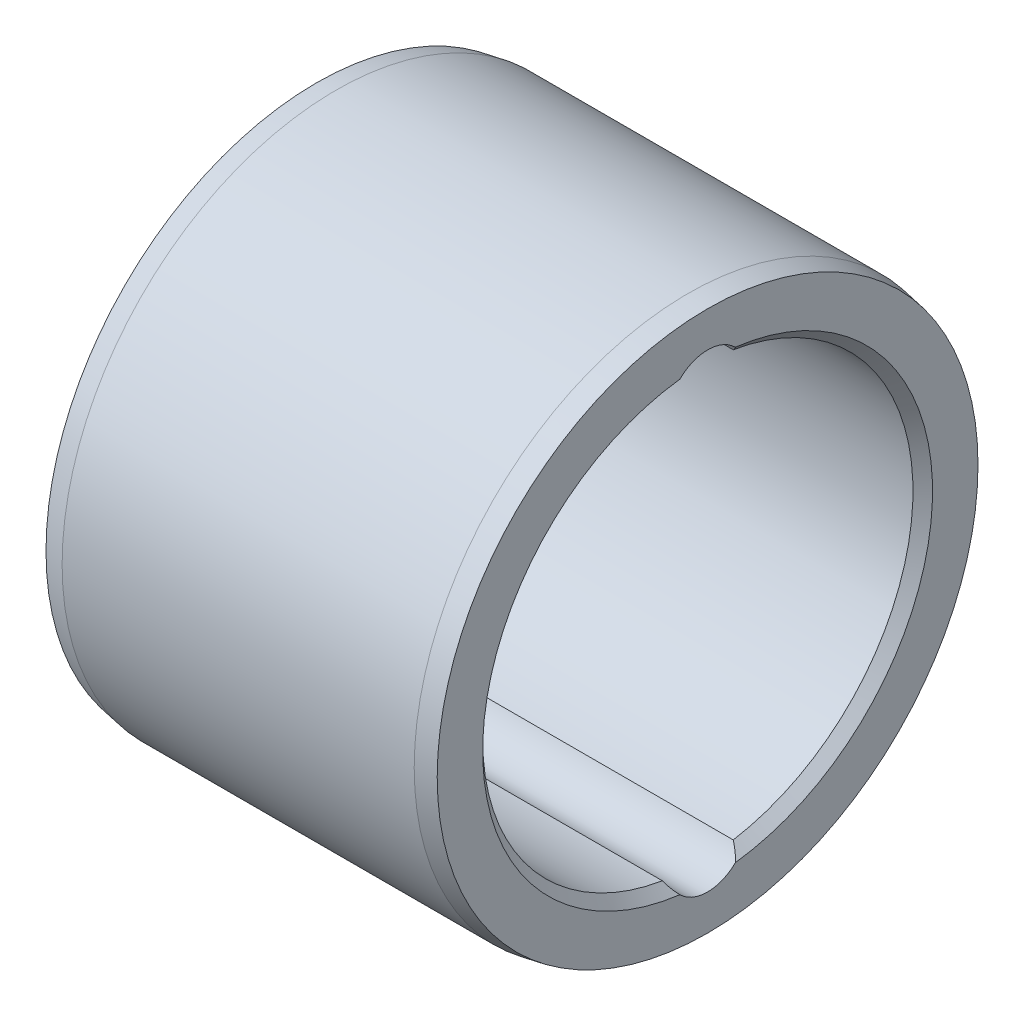
ISO-10303-21;
HEADER;
FILE_DESCRIPTION(('STEP AP214'),'2;1');
FILE_NAME('part.step','',(''),(''),'','','');
FILE_SCHEMA(('AUTOMOTIVE_DESIGN { 1 0 10303 214 1 1 1 1 }'));
ENDSEC;
DATA;
#1=APPLICATION_CONTEXT('core data for automotive mechanical design processes');
#2=APPLICATION_PROTOCOL_DEFINITION('international standard','automotive_design',2000,#1);
#3=PRODUCT_CONTEXT('',#1,'mechanical');
#4=PRODUCT('Part','Part','',(#3));
#5=PRODUCT_RELATED_PRODUCT_CATEGORY('part','',(#4));
#6=PRODUCT_DEFINITION_FORMATION('','',#4);
#7=PRODUCT_DEFINITION_CONTEXT('part definition',#1,'design');
#8=PRODUCT_DEFINITION('design','',#6,#7);
#9=PRODUCT_DEFINITION_SHAPE('','',#8);
#10=(LENGTH_UNIT() NAMED_UNIT(*) SI_UNIT(.MILLI.,.METRE.));
#11=(NAMED_UNIT(*) PLANE_ANGLE_UNIT() SI_UNIT($,.RADIAN.));
#12=(NAMED_UNIT(*) SI_UNIT($,.STERADIAN.) SOLID_ANGLE_UNIT());
#13=UNCERTAINTY_MEASURE_WITH_UNIT(LENGTH_MEASURE(1.E-05),#10,'distance_accuracy_value','');
#14=(GEOMETRIC_REPRESENTATION_CONTEXT(3) GLOBAL_UNCERTAINTY_ASSIGNED_CONTEXT((#13)) GLOBAL_UNIT_ASSIGNED_CONTEXT((#10,
#11,#12)) REPRESENTATION_CONTEXT('',''));
#15=CARTESIAN_POINT('',(0.,0.,0.));
#16=DIRECTION('',(0.,0.,1.));
#17=DIRECTION('',(1.,0.,0.));
#18=AXIS2_PLACEMENT_3D('',#15,#16,#17);
#19=CARTESIAN_POINT('',(19.5,0.,0.));
#20=DIRECTION('',(1.,0.,0.));
#21=DIRECTION('',(0.,0.,-1.));
#22=AXIS2_PLACEMENT_3D('',#19,#20,#21);
#23=CONICAL_SURFACE('',#22,11.,0.785398163397452);
#24=CARTESIAN_POINT('',(19.5,0.,0.));
#25=DIRECTION('',(-1.,0.,0.));
#26=DIRECTION('',(0.,0.,1.));
#27=AXIS2_PLACEMENT_3D('',#24,#25,#26);
#28=CIRCLE('',#27,11.);
#29=CARTESIAN_POINT('',(19.5,10.85,-1.81038669902317));
#30=VERTEX_POINT('',#29);
#31=CARTESIAN_POINT('',(19.5,-10.85,-1.81038669902317));
#32=VERTEX_POINT('',#31);
#33=EDGE_CURVE('E104',#30,#32,#28,.T.);
#34=ORIENTED_EDGE('',*,*,#33,.T.);
#35=CARTESIAN_POINT('',(19.4998181803155,-10.8498,-1.81048058813124));
#36=CARTESIAN_POINT('',(19.5451524840954,-10.8996647702299,-1.78707143879292));
#37=CARTESIAN_POINT('',(19.589809351135,-10.9490970053749,-1.76135782188333));
#38=CARTESIAN_POINT('',(19.6772080112991,-11.0464045453096,-1.70533709174544));
#39=CARTESIAN_POINT('',(19.7199596904916,-11.0942874144069,-1.67505847681478));
#40=CARTESIAN_POINT('',(19.8035478497243,-11.1884223834475,-1.60963876628118));
#41=CARTESIAN_POINT('',(19.844383924267,-11.2346741376046,-1.57449664732959));
#42=CARTESIAN_POINT('',(19.9240046002401,-11.3253137575687,-1.49901308462634));
#43=CARTESIAN_POINT('',(19.9627753196151,-11.3696886768266,-1.45864151638118));
#44=CARTESIAN_POINT('',(20.0002,-11.412730002,-1.4156955680686));
#45=B_SPLINE_CURVE_WITH_KNOTS('',3,(#35,#36,#37,#38,#39,#40,#41,#42,#43,#44),.UNSPECIFIED.,.F.,
.F.,(4,2,2,2,4),(0.,0.214017907991704,0.426751200810972,0.639529323911887,0.853592743294538),.UNSPECIFIED.);
#46=CARTESIAN_POINT('',(20.,-11.4125,-1.41592505098258));
#47=VERTEX_POINT('',#46);
#48=EDGE_CURVE('E114',#32,#47,#45,.T.);
#49=ORIENTED_EDGE('',*,*,#48,.T.);
#50=CARTESIAN_POINT('',(20.,0.,0.));
#51=DIRECTION('',(-1.,0.,0.));
#52=DIRECTION('',(0.,0.,1.));
#53=AXIS2_PLACEMENT_3D('',#50,#51,#52);
#54=CIRCLE('',#53,11.5);
#55=CARTESIAN_POINT('',(20.,11.4125,-1.41592505098256));
#56=VERTEX_POINT('',#55);
#57=EDGE_CURVE('E133',#56,#47,#54,.T.);
#58=ORIENTED_EDGE('',*,*,#57,.F.);
#59=CARTESIAN_POINT('',(20.0002,11.412730002,-1.4156955680686));
#60=CARTESIAN_POINT('',(19.9627753196151,11.3696886768266,-1.45864151638118));
#61=CARTESIAN_POINT('',(19.9240046002401,11.3253137575687,-1.49901308462634));
#62=CARTESIAN_POINT('',(19.844383924267,11.2346741376046,-1.57449664732959));
#63=CARTESIAN_POINT('',(19.8035478497243,11.1884223834475,-1.60963876628118));
#64=CARTESIAN_POINT('',(19.7199596904916,11.0942874144069,-1.67505847681478));
#65=CARTESIAN_POINT('',(19.6772080112991,11.0464045453096,-1.70533709174544));
#66=CARTESIAN_POINT('',(19.589809351135,10.9490970053749,-1.76135782188333));
#67=CARTESIAN_POINT('',(19.5451524840954,10.8996647702299,-1.78707143879292));
#68=CARTESIAN_POINT('',(19.4998181803155,10.8498,-1.81048058813124));
#69=B_SPLINE_CURVE_WITH_KNOTS('',3,(#59,#60,#61,#62,#63,#64,#65,#66,#67,#68),.UNSPECIFIED.,.F.,
.F.,(4,2,2,2,4),(0.,0.214063419382652,0.426841542483567,0.639574835302836,0.853592743294537),.UNSPECIFIED.);
#70=EDGE_CURVE('E125',#56,#30,#69,.T.);
#71=ORIENTED_EDGE('',*,*,#70,.T.);
#72=EDGE_LOOP('',(#34,#49,#58,#71));
#73=FACE_BOUND('',#72,.T.);
#74=ADVANCED_FACE('F42',(#73),#23,.F.);
#75=CARTESIAN_POINT('',(1.,0.,0.));
#76=DIRECTION('',(1.,0.,0.));
#77=DIRECTION('',(0.,0.,-1.));
#78=AXIS2_PLACEMENT_3D('',#75,#76,#77);
#79=CONICAL_SURFACE('',#78,14.,0.174532925199433);
#80=CARTESIAN_POINT('',(0.,0.,0.));
#81=DIRECTION('',(-1.,0.,0.));
#82=DIRECTION('',(0.,0.,1.));
#83=AXIS2_PLACEMENT_3D('',#80,#81,#82);
#84=CIRCLE('',#83,13.8236730192915);
#85=CARTESIAN_POINT('',(0.,0.,13.8236730192915));
#86=VERTEX_POINT('',#85);
#87=EDGE_CURVE('E322',#86,#86,#84,.T.);
#88=ORIENTED_EDGE('',*,*,#87,.F.);
#89=EDGE_LOOP('',(#88));
#90=FACE_BOUND('',#89,.T.);
#91=CARTESIAN_POINT('',(1.,0.,0.));
#92=DIRECTION('',(-1.,0.,0.));
#93=DIRECTION('',(0.,0.,1.));
#94=AXIS2_PLACEMENT_3D('',#91,#92,#93);
#95=CIRCLE('',#94,14.);
#96=CARTESIAN_POINT('',(1.,0.,14.));
#97=VERTEX_POINT('',#96);
#98=EDGE_CURVE('E149',#97,#97,#95,.T.);
#99=ORIENTED_EDGE('',*,*,#98,.T.);
#100=EDGE_LOOP('',(#99));
#101=FACE_BOUND('',#100,.T.);
#102=ADVANCED_FACE('F171',(#90,#101),#79,.T.);
#103=CARTESIAN_POINT('',(-7.00281462792265,0.,0.));
#104=DIRECTION('',(-1.,0.,0.));
#105=DIRECTION('',(0.,0.,1.));
#106=AXIS2_PLACEMENT_3D('',#103,#104,#105);
#107=CYLINDRICAL_SURFACE('',#106,14.);
#108=ORIENTED_EDGE('',*,*,#98,.F.);
#109=EDGE_LOOP('',(#108));
#110=FACE_BOUND('',#109,.T.);
#111=CARTESIAN_POINT('',(19.,0.,0.));
#112=DIRECTION('',(-1.,0.,0.));
#113=DIRECTION('',(0.,0.,1.));
#114=AXIS2_PLACEMENT_3D('',#111,#112,#113);
#115=CIRCLE('',#114,14.);
#116=CARTESIAN_POINT('',(19.,0.,14.));
#117=VERTEX_POINT('',#116);
#118=EDGE_CURVE('E145',#117,#117,#115,.T.);
#119=ORIENTED_EDGE('',*,*,#118,.T.);
#120=EDGE_LOOP('',(#119));
#121=FACE_BOUND('',#120,.T.);
#122=ADVANCED_FACE('F174',(#110,#121),#107,.T.);
#123=CARTESIAN_POINT('',(20.,0.,0.));
#124=DIRECTION('',(-1.,0.,0.));
#125=DIRECTION('',(0.,0.,1.));
#126=AXIS2_PLACEMENT_3D('',#123,#124,#125);
#127=CONICAL_SURFACE('',#126,13.8236730192915,0.174532925199434);
#128=ORIENTED_EDGE('',*,*,#118,.F.);
#129=EDGE_LOOP('',(#128));
#130=FACE_BOUND('',#129,.T.);
#131=CARTESIAN_POINT('',(20.,0.,0.));
#132=DIRECTION('',(-1.,0.,0.));
#133=DIRECTION('',(0.,0.,1.));
#134=AXIS2_PLACEMENT_3D('',#131,#132,#133);
#135=CIRCLE('',#134,13.8236730192915);
#136=CARTESIAN_POINT('',(20.,0.,13.8236730192915));
#137=VERTEX_POINT('',#136);
#138=EDGE_CURVE('E141',#137,#137,#135,.T.);
#139=ORIENTED_EDGE('',*,*,#138,.T.);
#140=EDGE_LOOP('',(#139));
#141=FACE_BOUND('',#140,.T.);
#142=ADVANCED_FACE('F178',(#130,#141),#127,.T.);
#143=CARTESIAN_POINT('',(20.,13.8236730192915,0.));
#144=DIRECTION('',(-1.,0.,0.));
#145=DIRECTION('',(0.,0.,1.));
#146=AXIS2_PLACEMENT_3D('',#143,#144,#145);
#147=PLANE('',#146);
#148=ORIENTED_EDGE('',*,*,#138,.F.);
#149=EDGE_LOOP('',(#148));
#150=FACE_BOUND('',#149,.T.);
#151=ORIENTED_EDGE('',*,*,#57,.T.);
#152=CARTESIAN_POINT('',(20.,-10.,0.));
#153=DIRECTION('',(1.,0.,0.));
#154=DIRECTION('',(0.,0.,-1.));
#155=AXIS2_PLACEMENT_3D('',#152,#153,#154);
#156=CIRCLE('',#155,2.);
#157=CARTESIAN_POINT('',(20.,-11.4125,1.41592505098256));
#158=VERTEX_POINT('',#157);
#159=EDGE_CURVE('E111',#158,#47,#156,.T.);
#160=ORIENTED_EDGE('',*,*,#159,.F.);
#161=CARTESIAN_POINT('',(20.,11.4125,1.41592505098258));
#162=VERTEX_POINT('',#161);
#163=EDGE_CURVE('E127',#158,#162,#54,.T.);
#164=ORIENTED_EDGE('',*,*,#163,.T.);
#165=CARTESIAN_POINT('',(20.,10.,0.));
#166=DIRECTION('',(1.,0.,0.));
#167=DIRECTION('',(0.,0.,1.));
#168=AXIS2_PLACEMENT_3D('',#165,#166,#167);
#169=CIRCLE('',#168,2.);
#170=EDGE_CURVE('E121',#56,#162,#169,.T.);
#171=ORIENTED_EDGE('',*,*,#170,.F.);
#172=EDGE_LOOP('',(#151,#160,#164,#171));
#173=FACE_BOUND('',#172,.T.);
#174=ADVANCED_FACE('F182',(#150,#173),#147,.F.);
#175=ORIENTED_EDGE('',*,*,#163,.F.);
#176=CARTESIAN_POINT('',(20.0002,-11.412730002,1.4156955680686));
#177=CARTESIAN_POINT('',(19.9627753196151,-11.3696886768266,1.45864151638118));
#178=CARTESIAN_POINT('',(19.9240046002401,-11.3253137575687,1.49901308462635));
#179=CARTESIAN_POINT('',(19.844383924267,-11.2346741376046,1.57449664732959));
#180=CARTESIAN_POINT('',(19.8035478497243,-11.1884223834475,1.60963876628118));
#181=CARTESIAN_POINT('',(19.7199596904916,-11.0942874144069,1.67505847681478));
#182=CARTESIAN_POINT('',(19.6772080112991,-11.0464045453096,1.70533709174544));
#183=CARTESIAN_POINT('',(19.589809351135,-10.9490970053749,1.76135782188333));
#184=CARTESIAN_POINT('',(19.5451524840954,-10.8996647702299,1.78707143879292));
#185=CARTESIAN_POINT('',(19.4998181803155,-10.8498,1.81048058813124));
#186=B_SPLINE_CURVE_WITH_KNOTS('',3,(#176,#177,#178,#179,#180,#181,#182,#183,#184,#185),
.UNSPECIFIED.,.F.,.F.,(4,2,2,2,4),(0.,0.214063419382652,0.426841542483567,0.639574835302833,
0.853592743294537),.UNSPECIFIED.);
#187=CARTESIAN_POINT('',(19.5,-10.85,1.81038669902317));
#188=VERTEX_POINT('',#187);
#189=EDGE_CURVE('E122',#158,#188,#186,.T.);
#190=ORIENTED_EDGE('',*,*,#189,.T.);
#191=CARTESIAN_POINT('',(19.5,10.85,1.81038669902317));
#192=VERTEX_POINT('',#191);
#193=EDGE_CURVE('E128',#188,#192,#28,.T.);
#194=ORIENTED_EDGE('',*,*,#193,.T.);
#195=CARTESIAN_POINT('',(19.4998181803155,10.8498,1.81048058813124));
#196=CARTESIAN_POINT('',(19.5451524840954,10.89966477023,1.78707143879292));
#197=CARTESIAN_POINT('',(19.589809351135,10.9490970053749,1.76135782188333));
#198=CARTESIAN_POINT('',(19.6772080112991,11.0464045453096,1.70533709174544));
#199=CARTESIAN_POINT('',(19.7199596904916,11.0942874144069,1.67505847681478));
#200=CARTESIAN_POINT('',(19.8035478497243,11.1884223834475,1.60963876628118));
#201=CARTESIAN_POINT('',(19.844383924267,11.2346741376046,1.57449664732959));
#202=CARTESIAN_POINT('',(19.9240046002401,11.3253137575687,1.49901308462635));
#203=CARTESIAN_POINT('',(19.9627753196151,11.3696886768266,1.45864151638118));
#204=CARTESIAN_POINT('',(20.0002,11.412730002,1.4156955680686));
#205=B_SPLINE_CURVE_WITH_KNOTS('',3,(#195,#196,#197,#198,#199,#200,#201,#202,#203,#204),
.UNSPECIFIED.,.F.,.F.,(4,2,2,2,4),(0.,0.214017907991705,0.426751200810972,0.639529323911884,
0.853592743294538),.UNSPECIFIED.);
#206=EDGE_CURVE('E201',#192,#162,#205,.T.);
#207=ORIENTED_EDGE('',*,*,#206,.T.);
#208=EDGE_LOOP('',(#175,#190,#194,#207));
#209=FACE_BOUND('',#208,.T.);
#210=ADVANCED_FACE('F185',(#209),#23,.F.);
#211=CARTESIAN_POINT('',(-7.00281462792265,0.,0.));
#212=DIRECTION('',(-1.,0.,0.));
#213=DIRECTION('',(0.,0.,1.));
#214=AXIS2_PLACEMENT_3D('',#211,#212,#213);
#215=CYLINDRICAL_SURFACE('',#214,11.);
#216=ORIENTED_EDGE('',*,*,#193,.F.);
#217=DIRECTION('',(1.,0.,0.));
#218=VECTOR('',#217,1.);
#219=CARTESIAN_POINT('',(-3.79901302972233,-10.85,1.81038669902317));
#220=LINE('',#219,#218);
#221=CARTESIAN_POINT('',(3.5,-10.85,1.81038669902317));
#222=VERTEX_POINT('',#221);
#223=EDGE_CURVE('E110',#222,#188,#220,.T.);
#224=ORIENTED_EDGE('',*,*,#223,.F.);
#225=CARTESIAN_POINT('',(3.5,-10.85,1.81038669902317));
#226=CARTESIAN_POINT('',(3.46413893683996,-10.8499986937818,1.81038791095002));
#227=CARTESIAN_POINT('',(3.42829617761777,-10.850257501121,1.80884412593424));
#228=CARTESIAN_POINT('',(3.35688946556425,-10.8512811666856,1.80269563628554));
#229=CARTESIAN_POINT('',(3.32132545155534,-10.8520459105342,1.79809162347628));
#230=CARTESIAN_POINT('',(3.21567864565657,-10.8550697189064,1.77978175526367));
#231=CARTESIAN_POINT('',(3.14634450658474,-10.8580585964366,1.76157750999367));
#232=CARTESIAN_POINT('',(3.01184600068678,-10.865683903722,1.71390976418376));
#233=CARTESIAN_POINT('',(2.94668023135095,-10.8703197758439,1.68445007421615));
#234=CARTESIAN_POINT('',(2.82205168168895,-10.880796442412,1.61538980913815));
#235=CARTESIAN_POINT('',(2.76259149383135,-10.8866377808287,1.57578465390203));
#236=CARTESIAN_POINT('',(2.64895064620647,-10.8991942493294,1.48648968852148));
#237=CARTESIAN_POINT('',(2.59498524275845,-10.9059305331457,1.43653007217132));
#238=CARTESIAN_POINT('',(2.49533734967088,-10.9195569774335,1.32898885323822));
#239=CARTESIAN_POINT('',(2.44965671108214,-10.9264471719077,1.27140555226814));
#240=CARTESIAN_POINT('',(2.36277902478872,-10.9405408453197,1.14414236796314));
#241=CARTESIAN_POINT('',(2.3225092035284,-10.9477050174747,1.07382787456395));
#242=CARTESIAN_POINT('',(2.25240083098586,-10.9610189302177,0.928124917930081));
#243=CARTESIAN_POINT('',(2.22256568059239,-10.967168339728,0.852734809970013));
#244=CARTESIAN_POINT('',(2.17761134992731,-10.9769577547054,0.71428938024463));
#245=CARTESIAN_POINT('',(2.1607389907863,-10.9808537165363,0.651804834500897));
#246=CARTESIAN_POINT('',(2.13253161570682,-10.9876217280845,0.525516973097011));
#247=CARTESIAN_POINT('',(2.1212001778837,-10.9904931158486,0.461712832934606));
#248=CARTESIAN_POINT('',(2.10336361181021,-10.9951410964569,0.333201217006729));
#249=CARTESIAN_POINT('',(2.09687443048,-10.9969140686829,0.268491465253657));
#250=CARTESIAN_POINT('',(2.0881834783491,-10.9993157610327,0.138783967433423));
#251=CARTESIAN_POINT('',(2.08598099295543,-10.9999446718707,0.0737862711776049));
#252=CARTESIAN_POINT('',(2.08564262485064,-11.0000409334395,-0.0469607326046084));
#253=CARTESIAN_POINT('',(2.08697217756622,-10.9996609779379,-0.10270862092079));
#254=CARTESIAN_POINT('',(2.09271895618635,-10.9980589774917,-0.214019593041054));
#255=CARTESIAN_POINT('',(2.09713598144858,-10.9968369872675,-0.269582688618325));
#256=CARTESIAN_POINT('',(2.11547285496653,-10.9919303974567,-0.435465195449523));
#257=CARTESIAN_POINT('',(2.13447471182643,-10.9870053171403,-0.545284412678826));
#258=CARTESIAN_POINT('',(2.18823970506003,-10.9745124885013,-0.755393063796314));
#259=CARTESIAN_POINT('',(2.22220812281947,-10.9670819431331,-0.855887215481214));
#260=CARTESIAN_POINT('',(2.30782885275773,-10.9502995891912,-1.04894528914297));
#261=CARTESIAN_POINT('',(2.35945380993645,-10.9409507614927,-1.14152120300986));
#262=CARTESIAN_POINT('',(2.46555190788838,-10.9239900901926,-1.29256967360334));
#263=CARTESIAN_POINT('',(2.51613299212234,-10.9165235422415,-1.3538016771967));
#264=CARTESIAN_POINT('',(2.62684460289559,-10.9018819982986,-1.46704565865788));
#265=CARTESIAN_POINT('',(2.6869738440275,-10.8947069632254,-1.51905887560034));
#266=CARTESIAN_POINT('',(2.81585107097252,-10.8813461094214,-1.61199729804792));
#267=CARTESIAN_POINT('',(2.88463972450043,-10.8751652942351,-1.65286709737848));
#268=CARTESIAN_POINT('',(3.02865442757406,-10.8645449406327,-1.72129930094429));
#269=CARTESIAN_POINT('',(3.1038736616837,-10.8601035858553,-1.74887559337248));
#270=CARTESIAN_POINT('',(3.23298823733342,-10.8545793417566,-1.78277934718567));
#271=CARTESIAN_POINT('',(3.2858385176744,-10.8528735579195,-1.79310354173585));
#272=CARTESIAN_POINT('',(3.39244643646274,-10.8505789552008,-1.80691715421927));
#273=CARTESIAN_POINT('',(3.44620406764567,-10.8499901273809,-1.8104066268466));
#274=CARTESIAN_POINT('',(3.5,-10.85,-1.81038669902317));
#275=B_SPLINE_CURVE_WITH_KNOTS('',3,(#225,#226,#227,#228,#229,#230,#231,#232,#233,#234,#235,
#236,#237,#238,#239,#240,#241,#242,#243,#244,#245,#246,#247,#248,#249,#250,#251,#252,#253,#254,
#255,#256,#257,#258,#259,#260,#261,#262,#263,#264,#265,#266,#267,#268,#269,#270,#271,#272,#273,
#274),.UNSPECIFIED.,.F.,.F.,(4,2,2,2,2,2,2,2,2,2,2,2,2,2,2,2,2,2,2,2,2,2,2,2,4),(0.,
0.107513156881117,0.215002016597984,0.429101970940049,0.643129505091251,0.857253831836538,
1.07788291389769,1.29856123017093,1.54166290762975,1.78484374359833,1.9790880205312,
2.17345756788955,2.36846443781314,2.5634387972709,2.73064076793054,2.89783187382214,
3.23129983462927,3.54886761952315,3.86594561374156,4.10427060673857,4.34256354272191,
4.58202054042879,4.82122682390431,4.98242898891324,5.14362986391486),.UNSPECIFIED.);
#276=CARTESIAN_POINT('',(3.5,-10.85,-1.81038669902317));
#277=VERTEX_POINT('',#276);
#278=EDGE_CURVE('E57',#222,#277,#275,.T.);
#279=ORIENTED_EDGE('',*,*,#278,.T.);
#280=DIRECTION('',(1.,0.,0.));
#281=VECTOR('',#280,1.);
#282=CARTESIAN_POINT('',(-3.79901302972233,-10.85,-1.81038669902317));
#283=LINE('',#282,#281);
#284=EDGE_CURVE('E98',#277,#32,#283,.T.);
#285=ORIENTED_EDGE('',*,*,#284,.T.);
#286=ORIENTED_EDGE('',*,*,#33,.F.);
#287=DIRECTION('',(1.,0.,0.));
#288=VECTOR('',#287,1.);
#289=CARTESIAN_POINT('',(-3.79901302972233,10.85,-1.81038669902317));
#290=LINE('',#289,#288);
#291=CARTESIAN_POINT('',(3.5,10.85,-1.81038669902317));
#292=VERTEX_POINT('',#291);
#293=EDGE_CURVE('E307',#292,#30,#290,.T.);
#294=ORIENTED_EDGE('',*,*,#293,.F.);
#295=CARTESIAN_POINT('',(3.5,10.85,-1.81038669902317));
#296=CARTESIAN_POINT('',(3.46413893683996,10.8499986937818,-1.81038791095002));
#297=CARTESIAN_POINT('',(3.42829617761778,10.850257501121,-1.80884412593424));
#298=CARTESIAN_POINT('',(3.35688946556425,10.8512811666856,-1.80269563628554));
#299=CARTESIAN_POINT('',(3.32132545155534,10.8520459105342,-1.79809162347628));
#300=CARTESIAN_POINT('',(3.21567864565657,10.8550697189064,-1.77978175526367));
#301=CARTESIAN_POINT('',(3.14634450658474,10.8580585964366,-1.76157750999367));
#302=CARTESIAN_POINT('',(3.01184600068678,10.865683903722,-1.71390976418376));
#303=CARTESIAN_POINT('',(2.94668023135095,10.8703197758439,-1.68445007421615));
#304=CARTESIAN_POINT('',(2.82205168168895,10.880796442412,-1.61538980913815));
#305=CARTESIAN_POINT('',(2.76259149383135,10.8866377808287,-1.57578465390203));
#306=CARTESIAN_POINT('',(2.64895064620647,10.8991942493294,-1.48648968852147));
#307=CARTESIAN_POINT('',(2.59498524275845,10.9059305331457,-1.43653007217132));
#308=CARTESIAN_POINT('',(2.49533734967088,10.9195569774335,-1.32898885323821));
#309=CARTESIAN_POINT('',(2.44965671108214,10.9264471719077,-1.27140555226814));
#310=CARTESIAN_POINT('',(2.36277902478872,10.9405408453197,-1.14414236796314));
#311=CARTESIAN_POINT('',(2.3225092035284,10.9477050174747,-1.07382787456395));
#312=CARTESIAN_POINT('',(2.25240083098586,10.9610189302177,-0.928124917930081));
#313=CARTESIAN_POINT('',(2.22256568059239,10.967168339728,-0.852734809970013));
#314=CARTESIAN_POINT('',(2.17761134992731,10.9769577547054,-0.714289380244631));
#315=CARTESIAN_POINT('',(2.1607389907863,10.9808537165363,-0.651804834500897));
#316=CARTESIAN_POINT('',(2.13253161570682,10.9876217280845,-0.525516973097011));
#317=CARTESIAN_POINT('',(2.1212001778837,10.9904931158486,-0.461712832934607));
#318=CARTESIAN_POINT('',(2.10336361181021,10.9951410964569,-0.333201217006729));
#319=CARTESIAN_POINT('',(2.09687443048,10.9969140686829,-0.268491465253657));
#320=CARTESIAN_POINT('',(2.0881834783491,10.9993157610327,-0.138783967433423));
#321=CARTESIAN_POINT('',(2.08598099295543,10.9999446718707,-0.0737862711776049));
#322=CARTESIAN_POINT('',(2.08564262485064,11.0000409334395,0.0469607326046084));
#323=CARTESIAN_POINT('',(2.08697217756622,10.9996609779379,0.10270862092079));
#324=CARTESIAN_POINT('',(2.09271895618635,10.9980589774917,0.214019593041053));
#325=CARTESIAN_POINT('',(2.09713598144858,10.9968369872675,0.269582688618325));
#326=CARTESIAN_POINT('',(2.11547285496653,10.9919303974567,0.435465195449523));
#327=CARTESIAN_POINT('',(2.13447471182643,10.9870053171403,0.545284412678826));
#328=CARTESIAN_POINT('',(2.18823970506003,10.9745124885013,0.755393063796313));
#329=CARTESIAN_POINT('',(2.22220812281947,10.9670819431331,0.855887215481214));
#330=CARTESIAN_POINT('',(2.30782885275773,10.9502995891912,1.04894528914297));
#331=CARTESIAN_POINT('',(2.35945380993645,10.9409507614927,1.14152120300986));
#332=CARTESIAN_POINT('',(2.46555190788838,10.9239900901926,1.29256967360334));
#333=CARTESIAN_POINT('',(2.51613299212234,10.9165235422415,1.3538016771967));
#334=CARTESIAN_POINT('',(2.62684460289559,10.9018819982986,1.46704565865788));
#335=CARTESIAN_POINT('',(2.6869738440275,10.8947069632254,1.51905887560034));
#336=CARTESIAN_POINT('',(2.81585107097252,10.8813461094214,1.61199729804792));
#337=CARTESIAN_POINT('',(2.88463972450042,10.8751652942351,1.65286709737848));
#338=CARTESIAN_POINT('',(3.02865442757406,10.8645449406327,1.72129930094429));
#339=CARTESIAN_POINT('',(3.1038736616837,10.8601035858553,1.74887559337248));
#340=CARTESIAN_POINT('',(3.23298823733342,10.8545793417566,1.78277934718567));
#341=CARTESIAN_POINT('',(3.2858385176744,10.8528735579195,1.79310354173585));
#342=CARTESIAN_POINT('',(3.39244643646274,10.8505789552008,1.80691715421927));
#343=CARTESIAN_POINT('',(3.44620406764567,10.8499901273809,1.8104066268466));
#344=CARTESIAN_POINT('',(3.5,10.85,1.81038669902317));
#345=B_SPLINE_CURVE_WITH_KNOTS('',3,(#295,#296,#297,#298,#299,#300,#301,#302,#303,#304,#305,
#306,#307,#308,#309,#310,#311,#312,#313,#314,#315,#316,#317,#318,#319,#320,#321,#322,#323,#324,
#325,#326,#327,#328,#329,#330,#331,#332,#333,#334,#335,#336,#337,#338,#339,#340,#341,#342,#343,
#344),.UNSPECIFIED.,.F.,.F.,(4,2,2,2,2,2,2,2,2,2,2,2,2,2,2,2,2,2,2,2,2,2,2,2,4),(0.,
0.107513156881116,0.215002016597984,0.429101970940049,0.643129505091252,0.857253831836538,
1.07788291389769,1.29856123017093,1.54166290762975,1.78484374359833,1.9790880205312,
2.17345756788955,2.36846443781314,2.5634387972709,2.73064076793054,2.89783187382214,
3.23129983462927,3.54886761952315,3.86594561374156,4.10427060673857,4.34256354272191,
4.58202054042879,4.82122682390431,4.98242898891324,5.14362986391486),.UNSPECIFIED.);
#346=CARTESIAN_POINT('',(3.5,10.85,1.81038669902317));
#347=VERTEX_POINT('',#346);
#348=EDGE_CURVE('E12',#292,#347,#345,.T.);
#349=ORIENTED_EDGE('',*,*,#348,.T.);
#350=DIRECTION('',(1.,0.,0.));
#351=VECTOR('',#350,1.);
#352=CARTESIAN_POINT('',(-3.79901302972233,10.85,1.81038669902317));
#353=LINE('',#352,#351);
#354=EDGE_CURVE('E309',#347,#192,#353,.T.);
#355=ORIENTED_EDGE('',*,*,#354,.T.);
#356=EDGE_LOOP('',(#216,#224,#279,#285,#286,#294,#349,#355));
#357=FACE_BOUND('',#356,.T.);
#358=CARTESIAN_POINT('',(0.5,0.,0.));
#359=DIRECTION('',(-1.,0.,0.));
#360=DIRECTION('',(0.,0.,1.));
#361=AXIS2_PLACEMENT_3D('',#358,#359,#360);
#362=CIRCLE('',#361,11.);
#363=CARTESIAN_POINT('',(0.5,0.,11.));
#364=VERTEX_POINT('',#363);
#365=EDGE_CURVE('E136',#364,#364,#362,.T.);
#366=ORIENTED_EDGE('',*,*,#365,.T.);
#367=EDGE_LOOP('',(#366));
#368=FACE_BOUND('',#367,.T.);
#369=ADVANCED_FACE('F101',(#357,#368),#215,.F.);
#370=CARTESIAN_POINT('',(0.,0.,0.));
#371=DIRECTION('',(-1.,0.,0.));
#372=DIRECTION('',(0.,0.,1.));
#373=AXIS2_PLACEMENT_3D('',#370,#371,#372);
#374=CONICAL_SURFACE('',#373,11.5,0.785398163397442);
#375=ORIENTED_EDGE('',*,*,#365,.F.);
#376=EDGE_LOOP('',(#375));
#377=FACE_BOUND('',#376,.T.);
#378=CARTESIAN_POINT('',(0.,0.,0.));
#379=DIRECTION('',(-1.,0.,0.));
#380=DIRECTION('',(0.,0.,1.));
#381=AXIS2_PLACEMENT_3D('',#378,#379,#380);
#382=CIRCLE('',#381,11.5);
#383=CARTESIAN_POINT('',(0.,0.,11.5));
#384=VERTEX_POINT('',#383);
#385=EDGE_CURVE('E327',#384,#384,#382,.T.);
#386=ORIENTED_EDGE('',*,*,#385,.T.);
#387=EDGE_LOOP('',(#386));
#388=FACE_BOUND('',#387,.T.);
#389=ADVANCED_FACE('F232',(#377,#388),#374,.F.);
#390=CARTESIAN_POINT('',(0.,11.5,0.));
#391=DIRECTION('',(1.,0.,0.));
#392=DIRECTION('',(0.,0.,-1.));
#393=AXIS2_PLACEMENT_3D('',#390,#391,#392);
#394=PLANE('',#393);
#395=ORIENTED_EDGE('',*,*,#385,.F.);
#396=EDGE_LOOP('',(#395));
#397=FACE_BOUND('',#396,.T.);
#398=ORIENTED_EDGE('',*,*,#87,.T.);
#399=EDGE_LOOP('',(#398));
#400=FACE_BOUND('',#399,.T.);
#401=ADVANCED_FACE('F228',(#397,#400),#394,.F.);
#402=CARTESIAN_POINT('',(-3.79901302972233,10.,0.));
#403=DIRECTION('',(1.,0.,0.));
#404=DIRECTION('',(0.,0.,-1.));
#405=AXIS2_PLACEMENT_3D('',#402,#403,#404);
#406=CYLINDRICAL_SURFACE('',#405,2.);
#407=ORIENTED_EDGE('',*,*,#354,.F.);
#408=CARTESIAN_POINT('',(3.5,10.,0.));
#409=DIRECTION('',(1.,0.,0.));
#410=DIRECTION('',(0.,0.,-1.));
#411=AXIS2_PLACEMENT_3D('',#408,#409,#410);
#412=CIRCLE('',#411,2.);
#413=EDGE_CURVE('E156',#347,#292,#412,.F.);
#414=ORIENTED_EDGE('',*,*,#413,.T.);
#415=ORIENTED_EDGE('',*,*,#293,.T.);
#416=ORIENTED_EDGE('',*,*,#70,.F.);
#417=ORIENTED_EDGE('',*,*,#170,.T.);
#418=ORIENTED_EDGE('',*,*,#206,.F.);
#419=EDGE_LOOP('',(#407,#414,#415,#416,#417,#418));
#420=FACE_BOUND('',#419,.T.);
#421=ADVANCED_FACE('F223',(#420),#406,.F.);
#422=CARTESIAN_POINT('',(-3.79901302972233,-10.,0.));
#423=DIRECTION('',(1.,0.,0.));
#424=DIRECTION('',(0.,0.,-1.));
#425=AXIS2_PLACEMENT_3D('',#422,#423,#424);
#426=CYLINDRICAL_SURFACE('',#425,2.);
#427=ORIENTED_EDGE('',*,*,#284,.F.);
#428=CARTESIAN_POINT('',(3.5,-10.,0.));
#429=DIRECTION('',(1.,0.,0.));
#430=DIRECTION('',(0.,0.,-1.));
#431=AXIS2_PLACEMENT_3D('',#428,#429,#430);
#432=CIRCLE('',#431,2.);
#433=EDGE_CURVE('E153',#277,#222,#432,.F.);
#434=ORIENTED_EDGE('',*,*,#433,.T.);
#435=ORIENTED_EDGE('',*,*,#223,.T.);
#436=ORIENTED_EDGE('',*,*,#189,.F.);
#437=ORIENTED_EDGE('',*,*,#159,.T.);
#438=ORIENTED_EDGE('',*,*,#48,.F.);
#439=EDGE_LOOP('',(#427,#434,#435,#436,#437,#438));
#440=FACE_BOUND('',#439,.T.);
#441=ADVANCED_FACE('F115',(#440),#426,.F.);
#442=CARTESIAN_POINT('',(3.5,-10.,0.));
#443=DIRECTION('',(1.,0.,0.));
#444=DIRECTION('',(0.,0.,-1.));
#445=AXIS2_PLACEMENT_3D('',#442,#443,#444);
#446=DEGENERATE_TOROIDAL_SURFACE('',#445,0.5,1.5,.T.);
#447=ORIENTED_EDGE('',*,*,#433,.F.);
#448=ORIENTED_EDGE('',*,*,#278,.F.);
#449=EDGE_LOOP('',(#447,#448));
#450=FACE_BOUND('',#449,.T.);
#451=ADVANCED_FACE('F166',(#450),#446,.F.);
#452=CARTESIAN_POINT('',(3.5,10.,0.));
#453=DIRECTION('',(1.,0.,0.));
#454=DIRECTION('',(0.,0.,-1.));
#455=AXIS2_PLACEMENT_3D('',#452,#453,#454);
#456=DEGENERATE_TOROIDAL_SURFACE('',#455,0.5,1.5,.T.);
#457=ORIENTED_EDGE('',*,*,#413,.F.);
#458=ORIENTED_EDGE('',*,*,#348,.F.);
#459=EDGE_LOOP('',(#457,#458));
#460=FACE_BOUND('',#459,.T.);
#461=ADVANCED_FACE('F44',(#460),#456,.F.);
#462=CLOSED_SHELL('',(#74,#102,#122,#142,#174,#210,#369,#389,#401,#421,#441,#451,#461));
#463=MANIFOLD_SOLID_BREP('B2',#462);
#464=ADVANCED_BREP_SHAPE_REPRESENTATION('',(#18,#463),#14);
#465=SHAPE_DEFINITION_REPRESENTATION(#9,#464);
ENDSEC;
END-ISO-10303-21;
